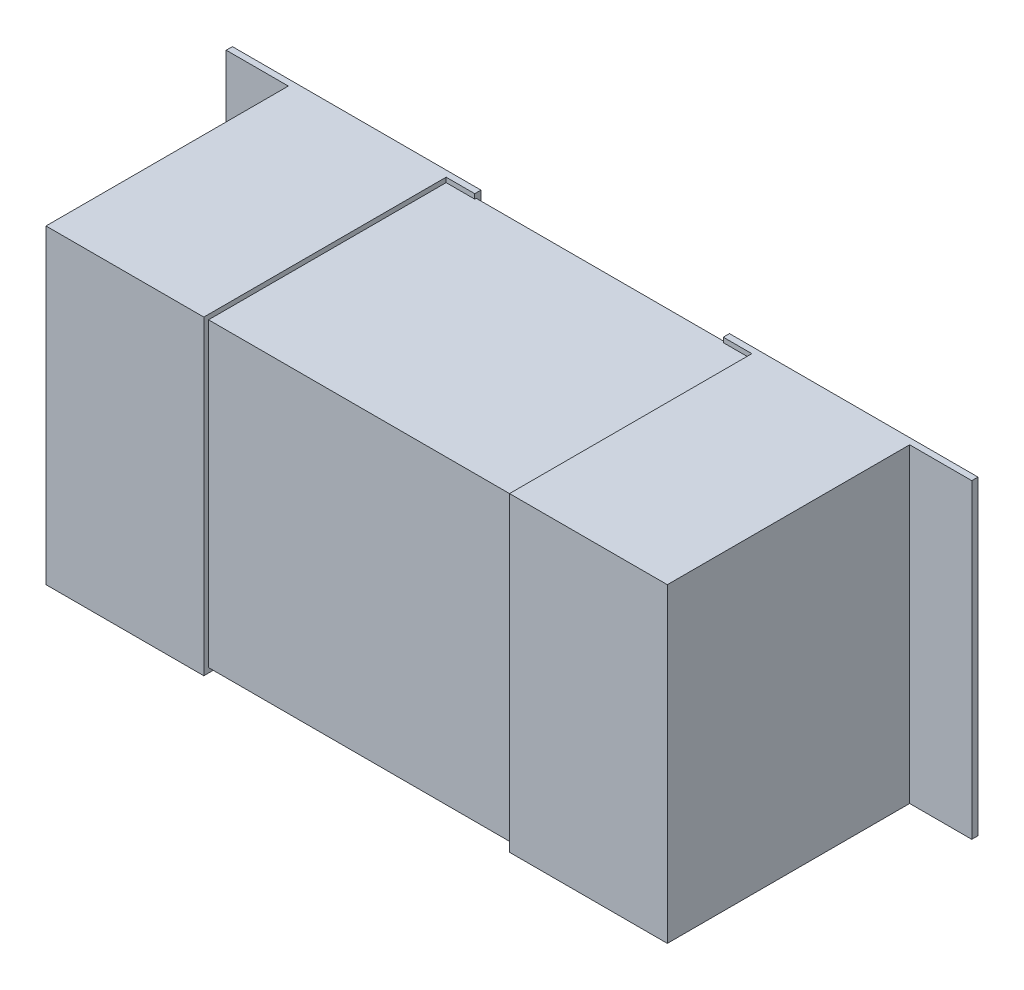
ISO-10303-21;
HEADER;
FILE_DESCRIPTION(('STEP AP214'),'2;1');
FILE_NAME('part.step','',(''),(''),'','','');
FILE_SCHEMA(('AUTOMOTIVE_DESIGN { 1 0 10303 214 1 1 1 1 }'));
ENDSEC;
DATA;
#1=APPLICATION_CONTEXT('core data for automotive mechanical design processes');
#2=APPLICATION_PROTOCOL_DEFINITION('international standard','automotive_design',2000,#1);
#3=PRODUCT_CONTEXT('',#1,'mechanical');
#4=PRODUCT('Part','Part','',(#3));
#5=PRODUCT_RELATED_PRODUCT_CATEGORY('part','',(#4));
#6=PRODUCT_DEFINITION_FORMATION('','',#4);
#7=PRODUCT_DEFINITION_CONTEXT('part definition',#1,'design');
#8=PRODUCT_DEFINITION('design','',#6,#7);
#9=PRODUCT_DEFINITION_SHAPE('','',#8);
#10=(LENGTH_UNIT() NAMED_UNIT(*) SI_UNIT(.MILLI.,.METRE.));
#11=(NAMED_UNIT(*) PLANE_ANGLE_UNIT() SI_UNIT($,.RADIAN.));
#12=(NAMED_UNIT(*) SI_UNIT($,.STERADIAN.) SOLID_ANGLE_UNIT());
#13=UNCERTAINTY_MEASURE_WITH_UNIT(LENGTH_MEASURE(1.E-05),#10,'distance_accuracy_value','');
#14=(GEOMETRIC_REPRESENTATION_CONTEXT(3) GLOBAL_UNCERTAINTY_ASSIGNED_CONTEXT((#13)) GLOBAL_UNIT_ASSIGNED_CONTEXT((#10,
#11,#12)) REPRESENTATION_CONTEXT('',''));
#15=CARTESIAN_POINT('',(0.,0.,0.));
#16=DIRECTION('',(0.,0.,1.));
#17=DIRECTION('',(1.,0.,0.));
#18=AXIS2_PLACEMENT_3D('',#15,#16,#17);
#19=CARTESIAN_POINT('',(0.5999988,-0.2500122,0.0762));
#20=DIRECTION('',(1.,0.,0.));
#21=DIRECTION('',(0.,0.,-1.));
#22=AXIS2_PLACEMENT_3D('',#19,#20,#21);
#23=PLANE('',#22);
#24=DIRECTION('',(0.,0.,-1.));
#25=VECTOR('',#24,1.);
#26=CARTESIAN_POINT('',(0.5999988,-0.25,0.0762));
#27=LINE('',#26,#25);
#28=CARTESIAN_POINT('',(0.5999988,-0.25,0.0762));
#29=VERTEX_POINT('',#28);
#30=CARTESIAN_POINT('',(0.5999988,-0.25,0.0862));
#31=VERTEX_POINT('',#30);
#32=EDGE_CURVE('E174',#29,#31,#27,.F.);
#33=ORIENTED_EDGE('',*,*,#32,.F.);
#34=DIRECTION('',(0.,1.,0.));
#35=VECTOR('',#34,1.);
#36=CARTESIAN_POINT('',(0.5999988,0.,0.0762));
#37=LINE('',#36,#35);
#38=CARTESIAN_POINT('',(0.5999988,0.25,0.0762));
#39=VERTEX_POINT('',#38);
#40=EDGE_CURVE('E202',#29,#39,#37,.T.);
#41=ORIENTED_EDGE('',*,*,#40,.T.);
#42=DIRECTION('',(0.,0.,1.));
#43=VECTOR('',#42,1.);
#44=CARTESIAN_POINT('',(0.5999988,0.25,0.0762));
#45=LINE('',#44,#43);
#46=CARTESIAN_POINT('',(0.5999988,0.25,0.0862));
#47=VERTEX_POINT('',#46);
#48=EDGE_CURVE('E189',#47,#39,#45,.F.);
#49=ORIENTED_EDGE('',*,*,#48,.F.);
#50=DIRECTION('',(0.,1.,0.));
#51=VECTOR('',#50,1.);
#52=CARTESIAN_POINT('',(0.5999988,0.,0.0862));
#53=LINE('',#52,#51);
#54=EDGE_CURVE('E20',#31,#47,#53,.T.);
#55=ORIENTED_EDGE('',*,*,#54,.F.);
#56=EDGE_LOOP('',(#33,#41,#49,#55));
#57=FACE_BOUND('',#56,.T.);
#58=ADVANCED_FACE('F17',(#57),#23,.T.);
#59=CARTESIAN_POINT('',(0.,0.,0.0862));
#60=DIRECTION('',(0.,0.,1.));
#61=DIRECTION('',(1.,0.,0.));
#62=AXIS2_PLACEMENT_3D('',#59,#60,#61);
#63=PLANE('',#62);
#64=DIRECTION('',(1.,0.,0.));
#65=VECTOR('',#64,1.);
#66=CARTESIAN_POINT('',(0.5,0.25,0.0862));
#67=LINE('',#66,#65);
#68=CARTESIAN_POINT('',(0.5,0.25,0.0862));
#69=VERTEX_POINT('',#68);
#70=EDGE_CURVE('E221',#69,#47,#67,.T.);
#71=ORIENTED_EDGE('',*,*,#70,.F.);
#72=DIRECTION('',(0.,1.,0.));
#73=VECTOR('',#72,1.);
#74=CARTESIAN_POINT('',(0.5,-0.25,0.0862));
#75=LINE('',#74,#73);
#76=CARTESIAN_POINT('',(0.5,-0.250001016666675,0.0862));
#77=VERTEX_POINT('',#76);
#78=EDGE_CURVE('E193',#77,#69,#75,.T.);
#79=ORIENTED_EDGE('',*,*,#78,.F.);
#80=DIRECTION('',(1.,0.,0.));
#81=VECTOR('',#80,1.);
#82=CARTESIAN_POINT('',(-0.5,-0.25,0.0862));
#83=LINE('',#82,#81);
#84=EDGE_CURVE('E179',#31,#77,#83,.F.);
#85=ORIENTED_EDGE('',*,*,#84,.F.);
#86=ORIENTED_EDGE('',*,*,#54,.T.);
#87=EDGE_LOOP('',(#71,#79,#85,#86));
#88=FACE_BOUND('',#87,.T.);
#89=ADVANCED_FACE('F194',(#88),#63,.T.);
#90=CARTESIAN_POINT('',(0.5,-0.25,0.0762));
#91=DIRECTION('',(1.,0.,0.));
#92=DIRECTION('',(0.,0.,-1.));
#93=AXIS2_PLACEMENT_3D('',#90,#91,#92);
#94=PLANE('',#93);
#95=DIRECTION('',(0.,0.,-1.));
#96=VECTOR('',#95,1.);
#97=CARTESIAN_POINT('',(0.5,-0.25,0.0762));
#98=LINE('',#97,#96);
#99=CARTESIAN_POINT('',(0.5,-0.25,0.4762));
#100=VERTEX_POINT('',#99);
#101=EDGE_CURVE('E196',#77,#100,#98,.F.);
#102=ORIENTED_EDGE('',*,*,#101,.F.);
#103=ORIENTED_EDGE('',*,*,#78,.T.);
#104=DIRECTION('',(0.,0.,1.));
#105=VECTOR('',#104,1.);
#106=CARTESIAN_POINT('',(0.5,0.25,0.0762));
#107=LINE('',#106,#105);
#108=CARTESIAN_POINT('',(0.5,0.25,0.4762));
#109=VERTEX_POINT('',#108);
#110=EDGE_CURVE('E218',#109,#69,#107,.F.);
#111=ORIENTED_EDGE('',*,*,#110,.F.);
#112=DIRECTION('',(0.,1.,0.));
#113=VECTOR('',#112,1.);
#114=CARTESIAN_POINT('',(0.5,0.,0.4762));
#115=LINE('',#114,#113);
#116=EDGE_CURVE('E228',#100,#109,#115,.T.);
#117=ORIENTED_EDGE('',*,*,#116,.F.);
#118=EDGE_LOOP('',(#102,#103,#111,#117));
#119=FACE_BOUND('',#118,.T.);
#120=ADVANCED_FACE('F543',(#119),#94,.T.);
#121=CARTESIAN_POINT('',(0.,0.,0.0762));
#122=DIRECTION('',(0.,0.,1.));
#123=DIRECTION('',(1.,0.,0.));
#124=AXIS2_PLACEMENT_3D('',#121,#122,#123);
#125=PLANE('',#124);
#126=DIRECTION('',(1.,0.,0.));
#127=VECTOR('',#126,1.);
#128=CARTESIAN_POINT('',(-0.5,-0.25,0.0762));
#129=LINE('',#128,#127);
#130=CARTESIAN_POINT('',(0.1999996,-0.25,0.0762));
#131=VERTEX_POINT('',#130);
#132=EDGE_CURVE('E182',#131,#29,#129,.T.);
#133=ORIENTED_EDGE('',*,*,#132,.F.);
#134=DIRECTION('',(0.,1.,0.));
#135=VECTOR('',#134,1.);
#136=CARTESIAN_POINT('',(0.1999996,0.2500122,0.0762));
#137=LINE('',#136,#135);
#138=CARTESIAN_POINT('',(0.1999996,0.25,0.0762));
#139=VERTEX_POINT('',#138);
#140=EDGE_CURVE('E275',#139,#131,#137,.F.);
#141=ORIENTED_EDGE('',*,*,#140,.F.);
#142=DIRECTION('',(1.,0.,0.));
#143=VECTOR('',#142,1.);
#144=CARTESIAN_POINT('',(0.5,0.25,0.0762));
#145=LINE('',#144,#143);
#146=EDGE_CURVE('E283',#39,#139,#145,.F.);
#147=ORIENTED_EDGE('',*,*,#146,.F.);
#148=ORIENTED_EDGE('',*,*,#40,.F.);
#149=EDGE_LOOP('',(#133,#141,#147,#148));
#150=FACE_BOUND('',#149,.T.);
#151=ADVANCED_FACE('F296',(#150),#125,.F.);
#152=CARTESIAN_POINT('',(-0.5999988,0.2500122,0.0762));
#153=DIRECTION('',(-1.,0.,0.));
#154=DIRECTION('',(0.,0.,1.));
#155=AXIS2_PLACEMENT_3D('',#152,#153,#154);
#156=PLANE('',#155);
#157=DIRECTION('',(0.,0.,1.));
#158=VECTOR('',#157,1.);
#159=CARTESIAN_POINT('',(-0.5999988,0.25,0.0762));
#160=LINE('',#159,#158);
#161=CARTESIAN_POINT('',(-0.5999988,0.25,0.0762));
#162=VERTEX_POINT('',#161);
#163=CARTESIAN_POINT('',(-0.5999988,0.25,0.0862));
#164=VERTEX_POINT('',#163);
#165=EDGE_CURVE('E257',#162,#164,#160,.T.);
#166=ORIENTED_EDGE('',*,*,#165,.F.);
#167=DIRECTION('',(0.,1.,0.));
#168=VECTOR('',#167,1.);
#169=CARTESIAN_POINT('',(-0.5999988,0.,0.0762));
#170=LINE('',#169,#168);
#171=CARTESIAN_POINT('',(-0.5999988,-0.25,0.0762));
#172=VERTEX_POINT('',#171);
#173=EDGE_CURVE('E222',#162,#172,#170,.F.);
#174=ORIENTED_EDGE('',*,*,#173,.T.);
#175=DIRECTION('',(0.,0.,-1.));
#176=VECTOR('',#175,1.);
#177=CARTESIAN_POINT('',(-0.5999988,-0.25,0.0762));
#178=LINE('',#177,#176);
#179=CARTESIAN_POINT('',(-0.5999988,-0.25,0.0862));
#180=VERTEX_POINT('',#179);
#181=EDGE_CURVE('E266',#180,#172,#178,.T.);
#182=ORIENTED_EDGE('',*,*,#181,.F.);
#183=DIRECTION('',(0.,1.,0.));
#184=VECTOR('',#183,1.);
#185=CARTESIAN_POINT('',(-0.5999988,0.,0.0862));
#186=LINE('',#185,#184);
#187=EDGE_CURVE('E286',#164,#180,#186,.F.);
#188=ORIENTED_EDGE('',*,*,#187,.F.);
#189=EDGE_LOOP('',(#166,#174,#182,#188));
#190=FACE_BOUND('',#189,.T.);
#191=ADVANCED_FACE('F537',(#190),#156,.T.);
#192=CARTESIAN_POINT('',(0.,0.,0.0862));
#193=DIRECTION('',(0.,0.,1.));
#194=DIRECTION('',(1.,0.,0.));
#195=AXIS2_PLACEMENT_3D('',#192,#193,#194);
#196=PLANE('',#195);
#197=DIRECTION('',(1.,0.,0.));
#198=VECTOR('',#197,1.);
#199=CARTESIAN_POINT('',(-0.5,-0.25,0.0862));
#200=LINE('',#199,#198);
#201=CARTESIAN_POINT('',(-0.5,-0.25,0.0862));
#202=VERTEX_POINT('',#201);
#203=EDGE_CURVE('E268',#202,#180,#200,.F.);
#204=ORIENTED_EDGE('',*,*,#203,.F.);
#205=DIRECTION('',(0.,1.,0.));
#206=VECTOR('',#205,1.);
#207=CARTESIAN_POINT('',(-0.5,0.25,0.0862));
#208=LINE('',#207,#206);
#209=CARTESIAN_POINT('',(-0.5,0.25,0.0862));
#210=VERTEX_POINT('',#209);
#211=EDGE_CURVE('E287',#210,#202,#208,.F.);
#212=ORIENTED_EDGE('',*,*,#211,.F.);
#213=DIRECTION('',(1.,0.,0.));
#214=VECTOR('',#213,1.);
#215=CARTESIAN_POINT('',(0.5,0.25,0.0862));
#216=LINE('',#215,#214);
#217=EDGE_CURVE('E259',#164,#210,#216,.T.);
#218=ORIENTED_EDGE('',*,*,#217,.F.);
#219=ORIENTED_EDGE('',*,*,#187,.T.);
#220=EDGE_LOOP('',(#204,#212,#218,#219));
#221=FACE_BOUND('',#220,.T.);
#222=ADVANCED_FACE('F533',(#221),#196,.T.);
#223=CARTESIAN_POINT('',(-0.5,0.25,0.0762));
#224=DIRECTION('',(-1.,0.,0.));
#225=DIRECTION('',(0.,0.,1.));
#226=AXIS2_PLACEMENT_3D('',#223,#224,#225);
#227=PLANE('',#226);
#228=DIRECTION('',(0.,0.,1.));
#229=VECTOR('',#228,1.);
#230=CARTESIAN_POINT('',(-0.5,0.25,0.0762));
#231=LINE('',#230,#229);
#232=CARTESIAN_POINT('',(-0.5,0.25,0.4762));
#233=VERTEX_POINT('',#232);
#234=EDGE_CURVE('E346',#210,#233,#231,.T.);
#235=ORIENTED_EDGE('',*,*,#234,.F.);
#236=ORIENTED_EDGE('',*,*,#211,.T.);
#237=DIRECTION('',(0.,0.,-1.));
#238=VECTOR('',#237,1.);
#239=CARTESIAN_POINT('',(-0.5,-0.25,0.0762));
#240=LINE('',#239,#238);
#241=CARTESIAN_POINT('',(-0.5,-0.25,0.4762));
#242=VERTEX_POINT('',#241);
#243=EDGE_CURVE('E271',#242,#202,#240,.T.);
#244=ORIENTED_EDGE('',*,*,#243,.F.);
#245=DIRECTION('',(0.,1.,0.));
#246=VECTOR('',#245,1.);
#247=CARTESIAN_POINT('',(-0.5,0.,0.4762));
#248=LINE('',#247,#246);
#249=EDGE_CURVE('E355',#233,#242,#248,.F.);
#250=ORIENTED_EDGE('',*,*,#249,.F.);
#251=EDGE_LOOP('',(#235,#236,#244,#250));
#252=FACE_BOUND('',#251,.T.);
#253=ADVANCED_FACE('F529',(#252),#227,.T.);
#254=CARTESIAN_POINT('',(0.,0.,0.0762));
#255=DIRECTION('',(0.,0.,1.));
#256=DIRECTION('',(1.,0.,0.));
#257=AXIS2_PLACEMENT_3D('',#254,#255,#256);
#258=PLANE('',#257);
#259=DIRECTION('',(1.,0.,0.));
#260=VECTOR('',#259,1.);
#261=CARTESIAN_POINT('',(0.5,0.25,0.0762));
#262=LINE('',#261,#260);
#263=CARTESIAN_POINT('',(-0.1999996,0.25,0.0762));
#264=VERTEX_POINT('',#263);
#265=EDGE_CURVE('E250',#264,#162,#262,.F.);
#266=ORIENTED_EDGE('',*,*,#265,.F.);
#267=DIRECTION('',(0.,1.,0.));
#268=VECTOR('',#267,1.);
#269=CARTESIAN_POINT('',(-0.1999996,-0.2500122,0.0762));
#270=LINE('',#269,#268);
#271=CARTESIAN_POINT('',(-0.1999996,-0.25,0.0762));
#272=VERTEX_POINT('',#271);
#273=EDGE_CURVE('E385',#272,#264,#270,.T.);
#274=ORIENTED_EDGE('',*,*,#273,.F.);
#275=DIRECTION('',(1.,0.,0.));
#276=VECTOR('',#275,1.);
#277=CARTESIAN_POINT('',(-0.5,-0.25,0.0762));
#278=LINE('',#277,#276);
#279=EDGE_CURVE('E264',#172,#272,#278,.T.);
#280=ORIENTED_EDGE('',*,*,#279,.F.);
#281=ORIENTED_EDGE('',*,*,#173,.F.);
#282=EDGE_LOOP('',(#266,#274,#280,#281));
#283=FACE_BOUND('',#282,.T.);
#284=ADVANCED_FACE('F526',(#283),#258,.F.);
#285=CARTESIAN_POINT('',(0.,0.,0.0862));
#286=DIRECTION('',(0.,0.,1.));
#287=DIRECTION('',(1.,0.,0.));
#288=AXIS2_PLACEMENT_3D('',#285,#286,#287);
#289=PLANE('',#288);
#290=DIRECTION('',(1.,0.,0.));
#291=VECTOR('',#290,1.);
#292=CARTESIAN_POINT('',(-0.246,0.24238,0.0862));
#293=LINE('',#292,#291);
#294=CARTESIAN_POINT('',(0.1999996,0.24238,0.0862));
#295=VERTEX_POINT('',#294);
#296=CARTESIAN_POINT('',(0.246,0.24238,0.0862));
#297=VERTEX_POINT('',#296);
#298=EDGE_CURVE('E245',#295,#297,#293,.T.);
#299=ORIENTED_EDGE('',*,*,#298,.T.);
#300=DIRECTION('',(0.,1.,0.));
#301=VECTOR('',#300,1.);
#302=CARTESIAN_POINT('',(0.246,-0.25,0.0862));
#303=LINE('',#302,#301);
#304=CARTESIAN_POINT('',(0.246,0.25,0.0862));
#305=VERTEX_POINT('',#304);
#306=EDGE_CURVE('E210',#297,#305,#303,.T.);
#307=ORIENTED_EDGE('',*,*,#306,.T.);
#308=DIRECTION('',(1.,0.,0.));
#309=VECTOR('',#308,1.);
#310=CARTESIAN_POINT('',(0.5,0.25,0.0862));
#311=LINE('',#310,#309);
#312=CARTESIAN_POINT('',(0.1999996,0.25,0.0862));
#313=VERTEX_POINT('',#312);
#314=EDGE_CURVE('E230',#313,#305,#311,.T.);
#315=ORIENTED_EDGE('',*,*,#314,.F.);
#316=DIRECTION('',(0.,1.,0.));
#317=VECTOR('',#316,1.);
#318=CARTESIAN_POINT('',(0.1999996,0.2500122,0.0862));
#319=LINE('',#318,#317);
#320=EDGE_CURVE('E279',#295,#313,#319,.T.);
#321=ORIENTED_EDGE('',*,*,#320,.F.);
#322=EDGE_LOOP('',(#299,#307,#315,#321));
#323=FACE_BOUND('',#322,.T.);
#324=ADVANCED_FACE('F310',(#323),#289,.T.);
#325=CARTESIAN_POINT('',(0.5,0.25,0.0762));
#326=DIRECTION('',(0.,1.,0.));
#327=DIRECTION('',(0.,0.,1.));
#328=AXIS2_PLACEMENT_3D('',#325,#326,#327);
#329=PLANE('',#328);
#330=ORIENTED_EDGE('',*,*,#314,.T.);
#331=DIRECTION('',(0.,0.,-1.));
#332=VECTOR('',#331,1.);
#333=CARTESIAN_POINT('',(0.246,0.2500040666667,0.08382));
#334=LINE('',#333,#332);
#335=CARTESIAN_POINT('',(0.246,0.250001016666675,0.4762));
#336=VERTEX_POINT('',#335);
#337=EDGE_CURVE('E206',#305,#336,#334,.F.);
#338=ORIENTED_EDGE('',*,*,#337,.T.);
#339=DIRECTION('',(1.,0.,0.));
#340=VECTOR('',#339,1.);
#341=CARTESIAN_POINT('',(0.,0.25,0.4762));
#342=LINE('',#341,#340);
#343=EDGE_CURVE('E185',#109,#336,#342,.F.);
#344=ORIENTED_EDGE('',*,*,#343,.F.);
#345=ORIENTED_EDGE('',*,*,#110,.T.);
#346=ORIENTED_EDGE('',*,*,#70,.T.);
#347=ORIENTED_EDGE('',*,*,#48,.T.);
#348=ORIENTED_EDGE('',*,*,#146,.T.);
#349=DIRECTION('',(0.,0.,-1.));
#350=VECTOR('',#349,1.);
#351=CARTESIAN_POINT('',(0.1999996,0.25,0.0762));
#352=LINE('',#351,#350);
#353=EDGE_CURVE('E276',#313,#139,#352,.T.);
#354=ORIENTED_EDGE('',*,*,#353,.F.);
#355=EDGE_LOOP('',(#330,#338,#344,#345,#346,#347,#348,#354));
#356=FACE_BOUND('',#355,.T.);
#357=ADVANCED_FACE('F299',(#356),#329,.T.);
#358=CARTESIAN_POINT('',(0.,0.,0.4762));
#359=DIRECTION('',(0.,0.,1.));
#360=DIRECTION('',(1.,0.,0.));
#361=AXIS2_PLACEMENT_3D('',#358,#359,#360);
#362=PLANE('',#361);
#363=ORIENTED_EDGE('',*,*,#343,.T.);
#364=DIRECTION('',(0.,1.,0.));
#365=VECTOR('',#364,1.);
#366=CARTESIAN_POINT('',(0.246,-0.25,0.4762));
#367=LINE('',#366,#365);
#368=CARTESIAN_POINT('',(0.246,-0.25,0.4762));
#369=VERTEX_POINT('',#368);
#370=EDGE_CURVE('E209',#336,#369,#367,.F.);
#371=ORIENTED_EDGE('',*,*,#370,.T.);
#372=DIRECTION('',(1.,0.,0.));
#373=VECTOR('',#372,1.);
#374=CARTESIAN_POINT('',(-0.5,-0.25,0.4762));
#375=LINE('',#374,#373);
#376=EDGE_CURVE('E198',#100,#369,#375,.F.);
#377=ORIENTED_EDGE('',*,*,#376,.F.);
#378=ORIENTED_EDGE('',*,*,#116,.T.);
#379=EDGE_LOOP('',(#363,#371,#377,#378));
#380=FACE_BOUND('',#379,.T.);
#381=ADVANCED_FACE('F451',(#380),#362,.T.);
#382=CARTESIAN_POINT('',(-0.5,-0.25,0.0762));
#383=DIRECTION('',(0.,-1.,0.));
#384=DIRECTION('',(0.,0.,-1.));
#385=AXIS2_PLACEMENT_3D('',#382,#383,#384);
#386=PLANE('',#385);
#387=DIRECTION('',(0.,0.,1.));
#388=VECTOR('',#387,1.);
#389=CARTESIAN_POINT('',(0.1999996,-0.25,0.0762));
#390=LINE('',#389,#388);
#391=CARTESIAN_POINT('',(0.1999996,-0.25,0.0862));
#392=VERTEX_POINT('',#391);
#393=EDGE_CURVE('E272',#131,#392,#390,.T.);
#394=ORIENTED_EDGE('',*,*,#393,.F.);
#395=ORIENTED_EDGE('',*,*,#132,.T.);
#396=ORIENTED_EDGE('',*,*,#32,.T.);
#397=ORIENTED_EDGE('',*,*,#84,.T.);
#398=ORIENTED_EDGE('',*,*,#101,.T.);
#399=ORIENTED_EDGE('',*,*,#376,.T.);
#400=DIRECTION('',(0.,0.,-1.));
#401=VECTOR('',#400,1.);
#402=CARTESIAN_POINT('',(0.246,-0.25,0.08382));
#403=LINE('',#402,#401);
#404=CARTESIAN_POINT('',(0.246,-0.25,0.0862));
#405=VERTEX_POINT('',#404);
#406=EDGE_CURVE('E375',#369,#405,#403,.T.);
#407=ORIENTED_EDGE('',*,*,#406,.T.);
#408=DIRECTION('',(1.,0.,0.));
#409=VECTOR('',#408,1.);
#410=CARTESIAN_POINT('',(0.,-0.25,0.0862));
#411=LINE('',#410,#409);
#412=EDGE_CURVE('E280',#392,#405,#411,.T.);
#413=ORIENTED_EDGE('',*,*,#412,.F.);
#414=EDGE_LOOP('',(#394,#395,#396,#397,#398,#399,#407,#413));
#415=FACE_BOUND('',#414,.T.);
#416=ADVANCED_FACE('F177',(#415),#386,.T.);
#417=CARTESIAN_POINT('',(0.,0.,0.0862));
#418=DIRECTION('',(0.,0.,1.));
#419=DIRECTION('',(1.,0.,0.));
#420=AXIS2_PLACEMENT_3D('',#417,#418,#419);
#421=PLANE('',#420);
#422=ORIENTED_EDGE('',*,*,#412,.T.);
#423=DIRECTION('',(0.,1.,0.));
#424=VECTOR('',#423,1.);
#425=CARTESIAN_POINT('',(0.246,0.,0.0862));
#426=LINE('',#425,#424);
#427=CARTESIAN_POINT('',(0.246,-0.24238,0.0862));
#428=VERTEX_POINT('',#427);
#429=EDGE_CURVE('E243',#405,#428,#426,.T.);
#430=ORIENTED_EDGE('',*,*,#429,.T.);
#431=DIRECTION('',(1.,0.,0.));
#432=VECTOR('',#431,1.);
#433=CARTESIAN_POINT('',(-0.246,-0.24238,0.0862));
#434=LINE('',#433,#432);
#435=CARTESIAN_POINT('',(0.1999996,-0.24238,0.0862));
#436=VERTEX_POINT('',#435);
#437=EDGE_CURVE('E399',#428,#436,#434,.F.);
#438=ORIENTED_EDGE('',*,*,#437,.T.);
#439=DIRECTION('',(0.,1.,0.));
#440=VECTOR('',#439,1.);
#441=CARTESIAN_POINT('',(0.1999996,0.2500122,0.0862));
#442=LINE('',#441,#440);
#443=EDGE_CURVE('E274',#392,#436,#442,.T.);
#444=ORIENTED_EDGE('',*,*,#443,.F.);
#445=EDGE_LOOP('',(#422,#430,#438,#444));
#446=FACE_BOUND('',#445,.T.);
#447=ADVANCED_FACE('F440',(#446),#421,.T.);
#448=CARTESIAN_POINT('',(0.1999996,0.2500122,0.0762));
#449=DIRECTION('',(-1.,0.,0.));
#450=DIRECTION('',(0.,0.,1.));
#451=AXIS2_PLACEMENT_3D('',#448,#449,#450);
#452=PLANE('',#451);
#453=DIRECTION('',(0.,0.,1.));
#454=VECTOR('',#453,1.);
#455=CARTESIAN_POINT('',(0.1999996,-0.24238,0.4762));
#456=LINE('',#455,#454);
#457=CARTESIAN_POINT('',(0.1999996,-0.24238,0.08382));
#458=VERTEX_POINT('',#457);
#459=EDGE_CURVE('E402',#436,#458,#456,.F.);
#460=ORIENTED_EDGE('',*,*,#459,.T.);
#461=DIRECTION('',(0.,1.,0.));
#462=VECTOR('',#461,1.);
#463=CARTESIAN_POINT('',(0.1999996,-0.25,0.08382));
#464=LINE('',#463,#462);
#465=CARTESIAN_POINT('',(0.1999996,0.24238,0.08382));
#466=VERTEX_POINT('',#465);
#467=EDGE_CURVE('E386',#458,#466,#464,.T.);
#468=ORIENTED_EDGE('',*,*,#467,.T.);
#469=DIRECTION('',(0.,0.,-1.));
#470=VECTOR('',#469,1.);
#471=CARTESIAN_POINT('',(0.1999996,0.24238,0.0762));
#472=LINE('',#471,#470);
#473=EDGE_CURVE('E306',#466,#295,#472,.F.);
#474=ORIENTED_EDGE('',*,*,#473,.T.);
#475=ORIENTED_EDGE('',*,*,#320,.T.);
#476=ORIENTED_EDGE('',*,*,#353,.T.);
#477=ORIENTED_EDGE('',*,*,#140,.T.);
#478=ORIENTED_EDGE('',*,*,#393,.T.);
#479=ORIENTED_EDGE('',*,*,#443,.T.);
#480=EDGE_LOOP('',(#460,#468,#474,#475,#476,#477,#478,#479));
#481=FACE_BOUND('',#480,.T.);
#482=ADVANCED_FACE('F302',(#481),#452,.T.);
#483=CARTESIAN_POINT('',(-0.246,-0.25,0.08382));
#484=DIRECTION('',(0.,0.,1.));
#485=DIRECTION('',(1.,0.,0.));
#486=AXIS2_PLACEMENT_3D('',#483,#484,#485);
#487=PLANE('',#486);
#488=DIRECTION('',(0.,1.,0.));
#489=VECTOR('',#488,1.);
#490=CARTESIAN_POINT('',(-0.1999996,-0.2500122,0.08382));
#491=LINE('',#490,#489);
#492=CARTESIAN_POINT('',(-0.1999996,0.24238,0.08382));
#493=VERTEX_POINT('',#492);
#494=CARTESIAN_POINT('',(-0.1999996,-0.24238,0.08382));
#495=VERTEX_POINT('',#494);
#496=EDGE_CURVE('E382',#493,#495,#491,.F.);
#497=ORIENTED_EDGE('',*,*,#496,.F.);
#498=DIRECTION('',(1.,0.,0.));
#499=VECTOR('',#498,1.);
#500=CARTESIAN_POINT('',(-0.246,0.24238,0.08382));
#501=LINE('',#500,#499);
#502=EDGE_CURVE('E322',#493,#466,#501,.T.);
#503=ORIENTED_EDGE('',*,*,#502,.T.);
#504=ORIENTED_EDGE('',*,*,#467,.F.);
#505=DIRECTION('',(1.,0.,0.));
#506=VECTOR('',#505,1.);
#507=CARTESIAN_POINT('',(-0.246,-0.24238,0.08382));
#508=LINE('',#507,#506);
#509=EDGE_CURVE('E393',#458,#495,#508,.F.);
#510=ORIENTED_EDGE('',*,*,#509,.T.);
#511=EDGE_LOOP('',(#497,#503,#504,#510));
#512=FACE_BOUND('',#511,.T.);
#513=ADVANCED_FACE('F510',(#512),#487,.F.);
#514=CARTESIAN_POINT('',(-0.1999996,-0.2500122,0.0762));
#515=DIRECTION('',(1.,0.,0.));
#516=DIRECTION('',(0.,0.,-1.));
#517=AXIS2_PLACEMENT_3D('',#514,#515,#516);
#518=PLANE('',#517);
#519=DIRECTION('',(0.,0.,-1.));
#520=VECTOR('',#519,1.);
#521=CARTESIAN_POINT('',(-0.1999996,0.24238,0.0762));
#522=LINE('',#521,#520);
#523=CARTESIAN_POINT('',(-0.1999996,0.24238,0.0862));
#524=VERTEX_POINT('',#523);
#525=EDGE_CURVE('E325',#524,#493,#522,.T.);
#526=ORIENTED_EDGE('',*,*,#525,.T.);
#527=ORIENTED_EDGE('',*,*,#496,.T.);
#528=DIRECTION('',(0.,0.,1.));
#529=VECTOR('',#528,1.);
#530=CARTESIAN_POINT('',(-0.1999996,-0.24238,0.4762));
#531=LINE('',#530,#529);
#532=CARTESIAN_POINT('',(-0.1999996,-0.24238,0.0862));
#533=VERTEX_POINT('',#532);
#534=EDGE_CURVE('E368',#495,#533,#531,.T.);
#535=ORIENTED_EDGE('',*,*,#534,.T.);
#536=DIRECTION('',(0.,1.,0.));
#537=VECTOR('',#536,1.);
#538=CARTESIAN_POINT('',(-0.1999996,0.,0.0862));
#539=LINE('',#538,#537);
#540=CARTESIAN_POINT('',(-0.1999996,-0.25,0.0862));
#541=VERTEX_POINT('',#540);
#542=EDGE_CURVE('E384',#541,#533,#539,.T.);
#543=ORIENTED_EDGE('',*,*,#542,.F.);
#544=DIRECTION('',(0.,0.,-1.));
#545=VECTOR('',#544,1.);
#546=CARTESIAN_POINT('',(-0.1999996,-0.25,0.0762));
#547=LINE('',#546,#545);
#548=EDGE_CURVE('E261',#272,#541,#547,.F.);
#549=ORIENTED_EDGE('',*,*,#548,.F.);
#550=ORIENTED_EDGE('',*,*,#273,.T.);
#551=DIRECTION('',(0.,0.,1.));
#552=VECTOR('',#551,1.);
#553=CARTESIAN_POINT('',(-0.1999996,0.25,0.0762));
#554=LINE('',#553,#552);
#555=CARTESIAN_POINT('',(-0.1999996,0.25,0.0862));
#556=VERTEX_POINT('',#555);
#557=EDGE_CURVE('E253',#556,#264,#554,.F.);
#558=ORIENTED_EDGE('',*,*,#557,.F.);
#559=DIRECTION('',(0.,1.,0.));
#560=VECTOR('',#559,1.);
#561=CARTESIAN_POINT('',(-0.1999996,0.,0.0862));
#562=LINE('',#561,#560);
#563=EDGE_CURVE('E249',#524,#556,#562,.T.);
#564=ORIENTED_EDGE('',*,*,#563,.F.);
#565=EDGE_LOOP('',(#526,#527,#535,#543,#549,#550,#558,#564));
#566=FACE_BOUND('',#565,.T.);
#567=ADVANCED_FACE('F506',(#566),#518,.T.);
#568=CARTESIAN_POINT('',(0.,0.,0.0862));
#569=DIRECTION('',(0.,0.,1.));
#570=DIRECTION('',(1.,0.,0.));
#571=AXIS2_PLACEMENT_3D('',#568,#569,#570);
#572=PLANE('',#571);
#573=DIRECTION('',(1.,0.,0.));
#574=VECTOR('',#573,1.);
#575=CARTESIAN_POINT('',(-0.246,-0.24238,0.0862));
#576=LINE('',#575,#574);
#577=CARTESIAN_POINT('',(-0.246,-0.24238,0.0862));
#578=VERTEX_POINT('',#577);
#579=EDGE_CURVE('E371',#533,#578,#576,.F.);
#580=ORIENTED_EDGE('',*,*,#579,.T.);
#581=DIRECTION('',(0.,1.,0.));
#582=VECTOR('',#581,1.);
#583=CARTESIAN_POINT('',(-0.246,-0.25,0.0862));
#584=LINE('',#583,#582);
#585=CARTESIAN_POINT('',(-0.246,-0.250002711111133,0.0862));
#586=VERTEX_POINT('',#585);
#587=EDGE_CURVE('E360',#578,#586,#584,.F.);
#588=ORIENTED_EDGE('',*,*,#587,.T.);
#589=DIRECTION('',(1.,0.,0.));
#590=VECTOR('',#589,1.);
#591=CARTESIAN_POINT('',(-0.5,-0.25,0.0862));
#592=LINE('',#591,#590);
#593=EDGE_CURVE('E263',#541,#586,#592,.F.);
#594=ORIENTED_EDGE('',*,*,#593,.F.);
#595=ORIENTED_EDGE('',*,*,#542,.T.);
#596=EDGE_LOOP('',(#580,#588,#594,#595));
#597=FACE_BOUND('',#596,.T.);
#598=ADVANCED_FACE('F502',(#597),#572,.T.);
#599=CARTESIAN_POINT('',(-0.5,-0.25,0.0762));
#600=DIRECTION('',(0.,-1.,0.));
#601=DIRECTION('',(0.,0.,-1.));
#602=AXIS2_PLACEMENT_3D('',#599,#600,#601);
#603=PLANE('',#602);
#604=ORIENTED_EDGE('',*,*,#593,.T.);
#605=DIRECTION('',(0.,0.,1.));
#606=VECTOR('',#605,1.);
#607=CARTESIAN_POINT('',(-0.246,-0.2500040666667,0.0762));
#608=LINE('',#607,#606);
#609=CARTESIAN_POINT('',(-0.246,-0.250002711111133,0.4762));
#610=VERTEX_POINT('',#609);
#611=EDGE_CURVE('E351',#586,#610,#608,.T.);
#612=ORIENTED_EDGE('',*,*,#611,.T.);
#613=DIRECTION('',(1.,0.,0.));
#614=VECTOR('',#613,1.);
#615=CARTESIAN_POINT('',(0.,-0.25,0.4762));
#616=LINE('',#615,#614);
#617=EDGE_CURVE('E260',#242,#610,#616,.T.);
#618=ORIENTED_EDGE('',*,*,#617,.F.);
#619=ORIENTED_EDGE('',*,*,#243,.T.);
#620=ORIENTED_EDGE('',*,*,#203,.T.);
#621=ORIENTED_EDGE('',*,*,#181,.T.);
#622=ORIENTED_EDGE('',*,*,#279,.T.);
#623=ORIENTED_EDGE('',*,*,#548,.T.);
#624=EDGE_LOOP('',(#604,#612,#618,#619,#620,#621,#622,#623));
#625=FACE_BOUND('',#624,.T.);
#626=ADVANCED_FACE('F498',(#625),#603,.T.);
#627=CARTESIAN_POINT('',(0.,0.,0.4762));
#628=DIRECTION('',(0.,0.,1.));
#629=DIRECTION('',(1.,0.,0.));
#630=AXIS2_PLACEMENT_3D('',#627,#628,#629);
#631=PLANE('',#630);
#632=ORIENTED_EDGE('',*,*,#617,.T.);
#633=DIRECTION('',(0.,1.,0.));
#634=VECTOR('',#633,1.);
#635=CARTESIAN_POINT('',(-0.246,-0.25,0.4762));
#636=LINE('',#635,#634);
#637=CARTESIAN_POINT('',(-0.246,0.25,0.4762));
#638=VERTEX_POINT('',#637);
#639=EDGE_CURVE('E336',#610,#638,#636,.T.);
#640=ORIENTED_EDGE('',*,*,#639,.T.);
#641=DIRECTION('',(1.,0.,0.));
#642=VECTOR('',#641,1.);
#643=CARTESIAN_POINT('',(0.5,0.25,0.4762));
#644=LINE('',#643,#642);
#645=EDGE_CURVE('E256',#233,#638,#644,.T.);
#646=ORIENTED_EDGE('',*,*,#645,.F.);
#647=ORIENTED_EDGE('',*,*,#249,.T.);
#648=EDGE_LOOP('',(#632,#640,#646,#647));
#649=FACE_BOUND('',#648,.T.);
#650=ADVANCED_FACE('F494',(#649),#631,.T.);
#651=CARTESIAN_POINT('',(0.5,0.25,0.0762));
#652=DIRECTION('',(0.,1.,0.));
#653=DIRECTION('',(0.,0.,1.));
#654=AXIS2_PLACEMENT_3D('',#651,#652,#653);
#655=PLANE('',#654);
#656=ORIENTED_EDGE('',*,*,#557,.T.);
#657=ORIENTED_EDGE('',*,*,#265,.T.);
#658=ORIENTED_EDGE('',*,*,#165,.T.);
#659=ORIENTED_EDGE('',*,*,#217,.T.);
#660=ORIENTED_EDGE('',*,*,#234,.T.);
#661=ORIENTED_EDGE('',*,*,#645,.T.);
#662=DIRECTION('',(0.,0.,1.));
#663=VECTOR('',#662,1.);
#664=CARTESIAN_POINT('',(-0.246,0.25,0.0762));
#665=LINE('',#664,#663);
#666=CARTESIAN_POINT('',(-0.246,0.25,0.0862));
#667=VERTEX_POINT('',#666);
#668=EDGE_CURVE('E242',#638,#667,#665,.F.);
#669=ORIENTED_EDGE('',*,*,#668,.T.);
#670=DIRECTION('',(-1.,0.,0.));
#671=VECTOR('',#670,1.);
#672=CARTESIAN_POINT('',(0.,0.25,0.0862));
#673=LINE('',#672,#671);
#674=EDGE_CURVE('E246',#556,#667,#673,.T.);
#675=ORIENTED_EDGE('',*,*,#674,.F.);
#676=EDGE_LOOP('',(#656,#657,#658,#659,#660,#661,#669,#675));
#677=FACE_BOUND('',#676,.T.);
#678=ADVANCED_FACE('F490',(#677),#655,.T.);
#679=CARTESIAN_POINT('',(0.,0.,0.0862));
#680=DIRECTION('',(0.,0.,1.));
#681=DIRECTION('',(1.,0.,0.));
#682=AXIS2_PLACEMENT_3D('',#679,#680,#681);
#683=PLANE('',#682);
#684=ORIENTED_EDGE('',*,*,#674,.T.);
#685=DIRECTION('',(0.,1.,0.));
#686=VECTOR('',#685,1.);
#687=CARTESIAN_POINT('',(-0.246,0.,0.0862));
#688=LINE('',#687,#686);
#689=CARTESIAN_POINT('',(-0.246,0.24238,0.0862));
#690=VERTEX_POINT('',#689);
#691=EDGE_CURVE('E238',#667,#690,#688,.F.);
#692=ORIENTED_EDGE('',*,*,#691,.T.);
#693=DIRECTION('',(1.,0.,0.));
#694=VECTOR('',#693,1.);
#695=CARTESIAN_POINT('',(-0.246,0.24238,0.0862));
#696=LINE('',#695,#694);
#697=EDGE_CURVE('E248',#690,#524,#696,.T.);
#698=ORIENTED_EDGE('',*,*,#697,.T.);
#699=ORIENTED_EDGE('',*,*,#563,.T.);
#700=EDGE_LOOP('',(#684,#692,#698,#699));
#701=FACE_BOUND('',#700,.T.);
#702=ADVANCED_FACE('F487',(#701),#683,.T.);
#703=CARTESIAN_POINT('',(-0.246,0.24238,0.0762));
#704=DIRECTION('',(0.,-1.,0.));
#705=DIRECTION('',(0.,0.,-1.));
#706=AXIS2_PLACEMENT_3D('',#703,#704,#705);
#707=PLANE('',#706);
#708=DIRECTION('',(-1.,0.,0.));
#709=VECTOR('',#708,1.);
#710=CARTESIAN_POINT('',(-0.246,0.24238,0.46858));
#711=LINE('',#710,#709);
#712=CARTESIAN_POINT('',(-0.246,0.24238,0.46858));
#713=VERTEX_POINT('',#712);
#714=CARTESIAN_POINT('',(0.246,0.24238,0.46858));
#715=VERTEX_POINT('',#714);
#716=EDGE_CURVE('E379',#713,#715,#711,.F.);
#717=ORIENTED_EDGE('',*,*,#716,.T.);
#718=DIRECTION('',(0.,0.,-1.));
#719=VECTOR('',#718,1.);
#720=CARTESIAN_POINT('',(0.246,0.24238,0.08382));
#721=LINE('',#720,#719);
#722=EDGE_CURVE('E215',#715,#297,#721,.T.);
#723=ORIENTED_EDGE('',*,*,#722,.T.);
#724=ORIENTED_EDGE('',*,*,#298,.F.);
#725=ORIENTED_EDGE('',*,*,#473,.F.);
#726=ORIENTED_EDGE('',*,*,#502,.F.);
#727=ORIENTED_EDGE('',*,*,#525,.F.);
#728=ORIENTED_EDGE('',*,*,#697,.F.);
#729=DIRECTION('',(0.,0.,1.));
#730=VECTOR('',#729,1.);
#731=CARTESIAN_POINT('',(-0.246,0.24238,0.0762));
#732=LINE('',#731,#730);
#733=EDGE_CURVE('E241',#690,#713,#732,.T.);
#734=ORIENTED_EDGE('',*,*,#733,.T.);
#735=EDGE_LOOP('',(#717,#723,#724,#725,#726,#727,#728,#734));
#736=FACE_BOUND('',#735,.T.);
#737=ADVANCED_FACE('F468',(#736),#707,.F.);
#738=CARTESIAN_POINT('',(0.246,-0.25,0.08382));
#739=DIRECTION('',(1.,0.,0.));
#740=DIRECTION('',(0.,0.,-1.));
#741=AXIS2_PLACEMENT_3D('',#738,#739,#740);
#742=PLANE('',#741);
#743=ORIENTED_EDGE('',*,*,#370,.F.);
#744=ORIENTED_EDGE('',*,*,#337,.F.);
#745=ORIENTED_EDGE('',*,*,#306,.F.);
#746=ORIENTED_EDGE('',*,*,#722,.F.);
#747=DIRECTION('',(0.,1.,0.));
#748=VECTOR('',#747,1.);
#749=CARTESIAN_POINT('',(0.246,0.25,0.46858));
#750=LINE('',#749,#748);
#751=CARTESIAN_POINT('',(0.246,-0.24238,0.46858));
#752=VERTEX_POINT('',#751);
#753=EDGE_CURVE('E458',#715,#752,#750,.F.);
#754=ORIENTED_EDGE('',*,*,#753,.T.);
#755=DIRECTION('',(0.,0.,1.));
#756=VECTOR('',#755,1.);
#757=CARTESIAN_POINT('',(0.246,-0.24238,0.4762));
#758=LINE('',#757,#756);
#759=EDGE_CURVE('E374',#752,#428,#758,.F.);
#760=ORIENTED_EDGE('',*,*,#759,.T.);
#761=ORIENTED_EDGE('',*,*,#429,.F.);
#762=ORIENTED_EDGE('',*,*,#406,.F.);
#763=EDGE_LOOP('',(#743,#744,#745,#746,#754,#760,#761,#762));
#764=FACE_BOUND('',#763,.T.);
#765=ADVANCED_FACE('F445',(#764),#742,.F.);
#766=CARTESIAN_POINT('',(-0.246,-0.24238,0.4762));
#767=DIRECTION('',(0.,1.,0.));
#768=DIRECTION('',(0.,0.,1.));
#769=AXIS2_PLACEMENT_3D('',#766,#767,#768);
#770=PLANE('',#769);
#771=ORIENTED_EDGE('',*,*,#509,.F.);
#772=ORIENTED_EDGE('',*,*,#459,.F.);
#773=ORIENTED_EDGE('',*,*,#437,.F.);
#774=ORIENTED_EDGE('',*,*,#759,.F.);
#775=DIRECTION('',(-1.,0.,0.));
#776=VECTOR('',#775,1.);
#777=CARTESIAN_POINT('',(-0.246,-0.24238,0.46858));
#778=LINE('',#777,#776);
#779=CARTESIAN_POINT('',(-0.246,-0.24238,0.46858));
#780=VERTEX_POINT('',#779);
#781=EDGE_CURVE('E26',#752,#780,#778,.T.);
#782=ORIENTED_EDGE('',*,*,#781,.T.);
#783=DIRECTION('',(0.,0.,1.));
#784=VECTOR('',#783,1.);
#785=CARTESIAN_POINT('',(-0.246,-0.24238,0.0762));
#786=LINE('',#785,#784);
#787=EDGE_CURVE('E34',#780,#578,#786,.F.);
#788=ORIENTED_EDGE('',*,*,#787,.T.);
#789=ORIENTED_EDGE('',*,*,#579,.F.);
#790=ORIENTED_EDGE('',*,*,#534,.F.);
#791=EDGE_LOOP('',(#771,#772,#773,#774,#782,#788,#789,#790));
#792=FACE_BOUND('',#791,.T.);
#793=ADVANCED_FACE('F436',(#792),#770,.F.);
#794=CARTESIAN_POINT('',(-0.246,-0.25,0.0762));
#795=DIRECTION('',(-1.,0.,0.));
#796=DIRECTION('',(0.,0.,1.));
#797=AXIS2_PLACEMENT_3D('',#794,#795,#796);
#798=PLANE('',#797);
#799=DIRECTION('',(0.,1.,0.));
#800=VECTOR('',#799,1.);
#801=CARTESIAN_POINT('',(-0.246,0.25,0.46858));
#802=LINE('',#801,#800);
#803=EDGE_CURVE('E11',#780,#713,#802,.T.);
#804=ORIENTED_EDGE('',*,*,#803,.T.);
#805=ORIENTED_EDGE('',*,*,#733,.F.);
#806=ORIENTED_EDGE('',*,*,#691,.F.);
#807=ORIENTED_EDGE('',*,*,#668,.F.);
#808=ORIENTED_EDGE('',*,*,#639,.F.);
#809=ORIENTED_EDGE('',*,*,#611,.F.);
#810=ORIENTED_EDGE('',*,*,#587,.F.);
#811=ORIENTED_EDGE('',*,*,#787,.F.);
#812=EDGE_LOOP('',(#804,#805,#806,#807,#808,#809,#810,#811));
#813=FACE_BOUND('',#812,.T.);
#814=ADVANCED_FACE('F472',(#813),#798,.F.);
#815=CARTESIAN_POINT('',(-0.246,0.25,0.46858));
#816=DIRECTION('',(0.,0.,-1.));
#817=DIRECTION('',(-1.,0.,0.));
#818=AXIS2_PLACEMENT_3D('',#815,#816,#817);
#819=PLANE('',#818);
#820=ORIENTED_EDGE('',*,*,#781,.F.);
#821=ORIENTED_EDGE('',*,*,#753,.F.);
#822=ORIENTED_EDGE('',*,*,#716,.F.);
#823=ORIENTED_EDGE('',*,*,#803,.F.);
#824=EDGE_LOOP('',(#820,#821,#822,#823));
#825=FACE_BOUND('',#824,.T.);
#826=ADVANCED_FACE('F465',(#825),#819,.F.);
#827=CLOSED_SHELL('',(#58,#89,#120,#151,#191,#222,#253,#284,#324,#357,#381,#416,#447,#482,#513,
#567,#598,#626,#650,#678,#702,#737,#765,#793,#814,#826));
#828=MANIFOLD_SOLID_BREP('B1',#827);
#829=ADVANCED_BREP_SHAPE_REPRESENTATION('',(#18,#828),#14);
#830=SHAPE_DEFINITION_REPRESENTATION(#9,#829);
ENDSEC;
END-ISO-10303-21;
